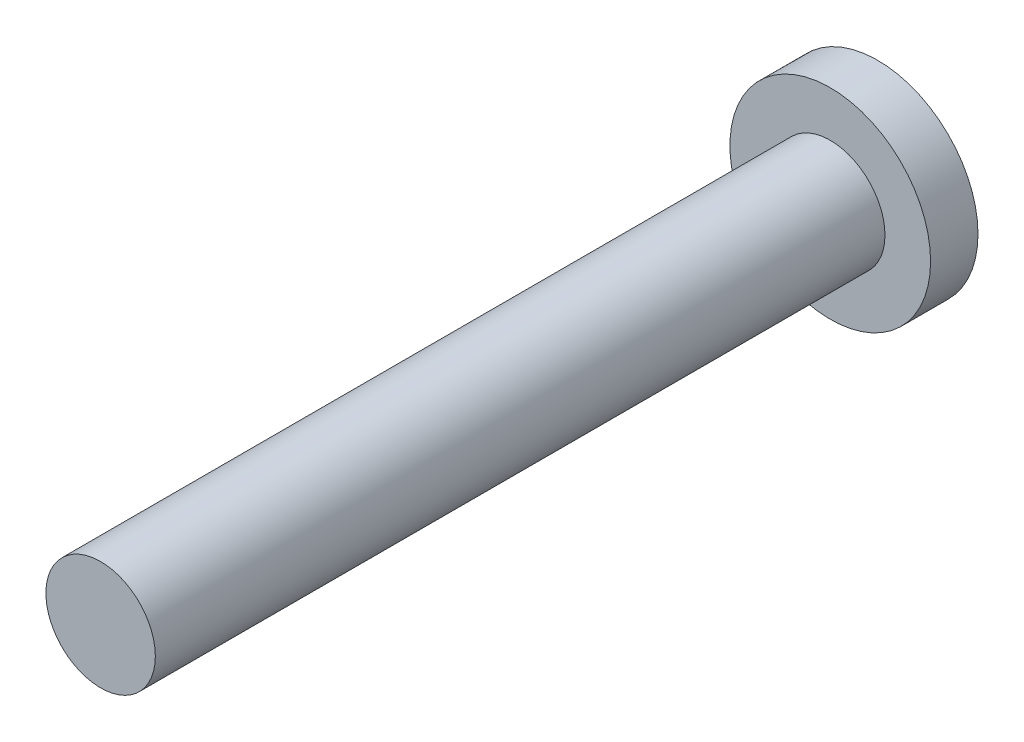
ISO-10303-21;
HEADER;
FILE_DESCRIPTION(('STEP AP214'),'2;1');
FILE_NAME('part.step','',(''),(''),'','','');
FILE_SCHEMA(('AUTOMOTIVE_DESIGN { 1 0 10303 214 1 1 1 1 }'));
ENDSEC;
DATA;
#1=APPLICATION_CONTEXT('core data for automotive mechanical design processes');
#2=APPLICATION_PROTOCOL_DEFINITION('international standard','automotive_design',2000,#1);
#3=PRODUCT_CONTEXT('',#1,'mechanical');
#4=PRODUCT('Part','Part','',(#3));
#5=PRODUCT_RELATED_PRODUCT_CATEGORY('part','',(#4));
#6=PRODUCT_DEFINITION_FORMATION('','',#4);
#7=PRODUCT_DEFINITION_CONTEXT('part definition',#1,'design');
#8=PRODUCT_DEFINITION('design','',#6,#7);
#9=PRODUCT_DEFINITION_SHAPE('','',#8);
#10=(LENGTH_UNIT() NAMED_UNIT(*) SI_UNIT(.MILLI.,.METRE.));
#11=(NAMED_UNIT(*) PLANE_ANGLE_UNIT() SI_UNIT($,.RADIAN.));
#12=(NAMED_UNIT(*) SI_UNIT($,.STERADIAN.) SOLID_ANGLE_UNIT());
#13=UNCERTAINTY_MEASURE_WITH_UNIT(LENGTH_MEASURE(1.E-05),#10,'distance_accuracy_value','');
#14=(GEOMETRIC_REPRESENTATION_CONTEXT(3) GLOBAL_UNCERTAINTY_ASSIGNED_CONTEXT((#13)) GLOBAL_UNIT_ASSIGNED_CONTEXT((#10,
#11,#12)) REPRESENTATION_CONTEXT('',''));
#15=CARTESIAN_POINT('',(0.,0.,0.));
#16=DIRECTION('',(0.,0.,1.));
#17=DIRECTION('',(1.,0.,0.));
#18=AXIS2_PLACEMENT_3D('',#15,#16,#17);
#19=CARTESIAN_POINT('',(0.,0.,20.));
#20=DIRECTION('',(0.,0.,-1.));
#21=DIRECTION('',(-1.,0.,0.));
#22=AXIS2_PLACEMENT_3D('',#19,#20,#21);
#23=CYLINDRICAL_SURFACE('',#22,1.5);
#24=CARTESIAN_POINT('',(0.,0.,20.));
#25=DIRECTION('',(0.,0.,1.));
#26=DIRECTION('',(1.,0.,0.));
#27=AXIS2_PLACEMENT_3D('',#24,#25,#26);
#28=CIRCLE('',#27,1.5);
#29=CARTESIAN_POINT('',(1.5,0.,20.));
#30=VERTEX_POINT('',#29);
#31=EDGE_CURVE('E10',#30,#30,#28,.T.);
#32=ORIENTED_EDGE('',*,*,#31,.F.);
#33=EDGE_LOOP('',(#32));
#34=FACE_BOUND('',#33,.T.);
#35=CARTESIAN_POINT('',(0.,0.,0.));
#36=DIRECTION('',(0.,0.,1.));
#37=DIRECTION('',(1.,0.,0.));
#38=AXIS2_PLACEMENT_3D('',#35,#36,#37);
#39=CIRCLE('',#38,1.5);
#40=CARTESIAN_POINT('',(1.5,0.,0.));
#41=VERTEX_POINT('',#40);
#42=EDGE_CURVE('E50',#41,#41,#39,.T.);
#43=ORIENTED_EDGE('',*,*,#42,.T.);
#44=EDGE_LOOP('',(#43));
#45=FACE_BOUND('',#44,.T.);
#46=ADVANCED_FACE('F47',(#34,#45),#23,.T.);
#47=CARTESIAN_POINT('',(0.,0.,20.));
#48=DIRECTION('',(0.,0.,1.));
#49=DIRECTION('',(1.,0.,0.));
#50=AXIS2_PLACEMENT_3D('',#47,#48,#49);
#51=PLANE('',#50);
#52=ORIENTED_EDGE('',*,*,#31,.T.);
#53=EDGE_LOOP('',(#52));
#54=FACE_BOUND('',#53,.T.);
#55=ADVANCED_FACE('F78',(#54),#51,.T.);
#56=CARTESIAN_POINT('',(0.,0.,-1.3));
#57=DIRECTION('',(0.,0.,1.));
#58=DIRECTION('',(1.,0.,0.));
#59=AXIS2_PLACEMENT_3D('',#56,#57,#58);
#60=CYLINDRICAL_SURFACE('',#59,2.75);
#61=CARTESIAN_POINT('',(0.,0.,-1.3));
#62=DIRECTION('',(0.,0.,1.));
#63=DIRECTION('',(1.,0.,0.));
#64=AXIS2_PLACEMENT_3D('',#61,#62,#63);
#65=CIRCLE('',#64,2.75);
#66=CARTESIAN_POINT('',(2.75,0.,-1.3));
#67=VERTEX_POINT('',#66);
#68=EDGE_CURVE('E57',#67,#67,#65,.T.);
#69=ORIENTED_EDGE('',*,*,#68,.T.);
#70=EDGE_LOOP('',(#69));
#71=FACE_BOUND('',#70,.T.);
#72=CARTESIAN_POINT('',(0.,0.,0.));
#73=DIRECTION('',(0.,0.,1.));
#74=DIRECTION('',(1.,0.,0.));
#75=AXIS2_PLACEMENT_3D('',#72,#73,#74);
#76=CIRCLE('',#75,2.75);
#77=CARTESIAN_POINT('',(2.75,0.,0.));
#78=VERTEX_POINT('',#77);
#79=EDGE_CURVE('E59',#78,#78,#76,.T.);
#80=ORIENTED_EDGE('',*,*,#79,.F.);
#81=EDGE_LOOP('',(#80));
#82=FACE_BOUND('',#81,.T.);
#83=ADVANCED_FACE('F65',(#71,#82),#60,.T.);
#84=CARTESIAN_POINT('',(0.,0.,-1.3));
#85=DIRECTION('',(0.,0.,1.));
#86=DIRECTION('',(1.,0.,0.));
#87=AXIS2_PLACEMENT_3D('',#84,#85,#86);
#88=PLANE('',#87);
#89=ORIENTED_EDGE('',*,*,#68,.F.);
#90=EDGE_LOOP('',(#89));
#91=FACE_BOUND('',#90,.T.);
#92=ADVANCED_FACE('F68',(#91),#88,.F.);
#93=CARTESIAN_POINT('',(0.,0.,0.));
#94=DIRECTION('',(0.,0.,1.));
#95=DIRECTION('',(1.,0.,0.));
#96=AXIS2_PLACEMENT_3D('',#93,#94,#95);
#97=PLANE('',#96);
#98=ORIENTED_EDGE('',*,*,#42,.F.);
#99=EDGE_LOOP('',(#98));
#100=FACE_BOUND('',#99,.T.);
#101=ORIENTED_EDGE('',*,*,#79,.T.);
#102=EDGE_LOOP('',(#101));
#103=FACE_BOUND('',#102,.T.);
#104=ADVANCED_FACE('F70',(#100,#103),#97,.T.);
#105=CLOSED_SHELL('',(#46,#55,#83,#92,#104));
#106=MANIFOLD_SOLID_BREP('B2',#105);
#107=ADVANCED_BREP_SHAPE_REPRESENTATION('',(#18,#106),#14);
#108=SHAPE_DEFINITION_REPRESENTATION(#9,#107);
ENDSEC;
END-ISO-10303-21;
